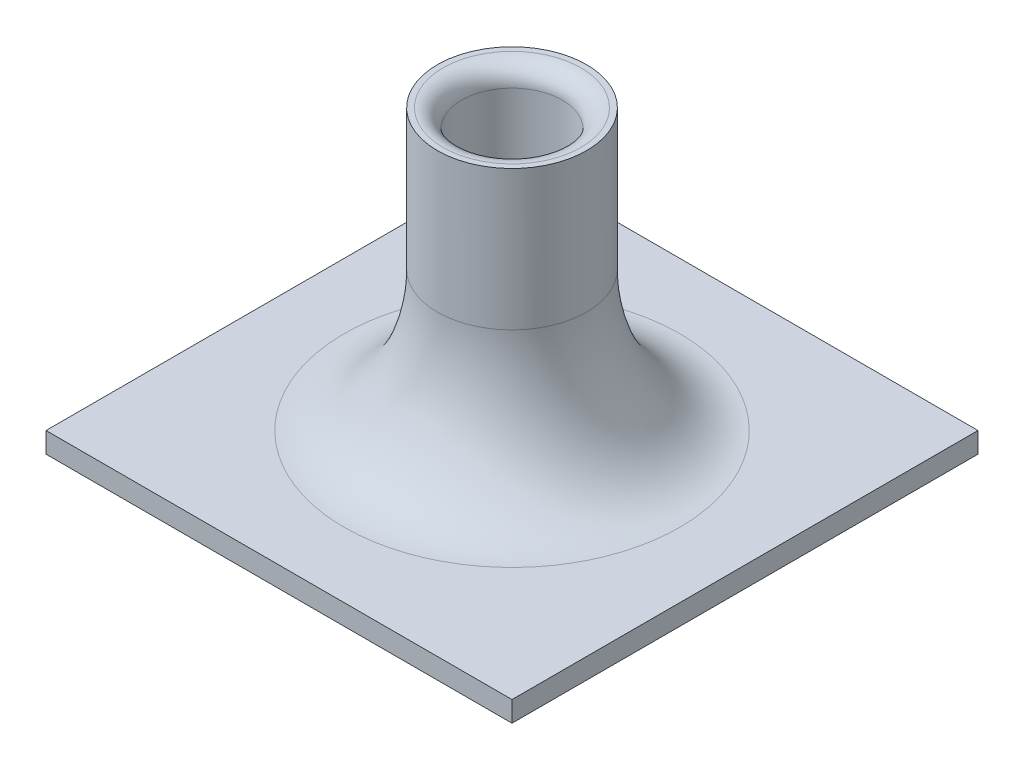
ISO-10303-21;
HEADER;
FILE_DESCRIPTION(('STEP AP214'),'2;1');
FILE_NAME('part.step','',(''),(''),'','','');
FILE_SCHEMA(('AUTOMOTIVE_DESIGN { 1 0 10303 214 1 1 1 1 }'));
ENDSEC;
DATA;
#1=APPLICATION_CONTEXT('core data for automotive mechanical design processes');
#2=APPLICATION_PROTOCOL_DEFINITION('international standard','automotive_design',2000,#1);
#3=PRODUCT_CONTEXT('',#1,'mechanical');
#4=PRODUCT('Part','Part','',(#3));
#5=PRODUCT_RELATED_PRODUCT_CATEGORY('part','',(#4));
#6=PRODUCT_DEFINITION_FORMATION('','',#4);
#7=PRODUCT_DEFINITION_CONTEXT('part definition',#1,'design');
#8=PRODUCT_DEFINITION('design','',#6,#7);
#9=PRODUCT_DEFINITION_SHAPE('','',#8);
#10=(LENGTH_UNIT() NAMED_UNIT(*) SI_UNIT(.MILLI.,.METRE.));
#11=(NAMED_UNIT(*) PLANE_ANGLE_UNIT() SI_UNIT($,.RADIAN.));
#12=(NAMED_UNIT(*) SI_UNIT($,.STERADIAN.) SOLID_ANGLE_UNIT());
#13=UNCERTAINTY_MEASURE_WITH_UNIT(LENGTH_MEASURE(1.E-05),#10,'distance_accuracy_value','');
#14=(GEOMETRIC_REPRESENTATION_CONTEXT(3) GLOBAL_UNCERTAINTY_ASSIGNED_CONTEXT((#13)) GLOBAL_UNIT_ASSIGNED_CONTEXT((#10,
#11,#12)) REPRESENTATION_CONTEXT('',''));
#15=CARTESIAN_POINT('',(0.,0.,0.));
#16=DIRECTION('',(0.,0.,1.));
#17=DIRECTION('',(1.,0.,0.));
#18=AXIS2_PLACEMENT_3D('',#15,#16,#17);
#19=CARTESIAN_POINT('',(25.,5.,25.));
#20=DIRECTION('',(-1.,0.,0.));
#21=DIRECTION('',(0.,0.,1.));
#22=AXIS2_PLACEMENT_3D('',#19,#20,#21);
#23=PLANE('',#22);
#24=DIRECTION('',(0.,-1.,0.));
#25=VECTOR('',#24,1.);
#26=CARTESIAN_POINT('',(25.,5.,25.));
#27=LINE('',#26,#25);
#28=CARTESIAN_POINT('',(25.,5.,25.));
#29=VERTEX_POINT('',#28);
#30=CARTESIAN_POINT('',(25.,2.79784594893,25.));
#31=VERTEX_POINT('',#30);
#32=EDGE_CURVE('E294',#29,#31,#27,.T.);
#33=ORIENTED_EDGE('',*,*,#32,.T.);
#34=DIRECTION('',(0.,0.,-1.));
#35=VECTOR('',#34,1.);
#36=CARTESIAN_POINT('',(25.,2.79784594893,-25.));
#37=LINE('',#36,#35);
#38=CARTESIAN_POINT('',(25.,2.79784594893,-25.));
#39=VERTEX_POINT('',#38);
#40=EDGE_CURVE('E56',#31,#39,#37,.T.);
#41=ORIENTED_EDGE('',*,*,#40,.T.);
#42=DIRECTION('',(0.,-1.,0.));
#43=VECTOR('',#42,1.);
#44=CARTESIAN_POINT('',(25.,5.,-25.));
#45=LINE('',#44,#43);
#46=CARTESIAN_POINT('',(25.,5.,-25.));
#47=VERTEX_POINT('',#46);
#48=EDGE_CURVE('E110',#47,#39,#45,.T.);
#49=ORIENTED_EDGE('',*,*,#48,.F.);
#50=DIRECTION('',(0.,0.,-1.));
#51=VECTOR('',#50,1.);
#52=CARTESIAN_POINT('',(25.,5.,25.));
#53=LINE('',#52,#51);
#54=EDGE_CURVE('E117',#29,#47,#53,.T.);
#55=ORIENTED_EDGE('',*,*,#54,.F.);
#56=EDGE_LOOP('',(#33,#41,#49,#55));
#57=FACE_BOUND('',#56,.T.);
#58=ADVANCED_FACE('F45',(#57),#23,.F.);
#59=CARTESIAN_POINT('',(-25.,5.,-25.));
#60=DIRECTION('',(0.,0.,1.));
#61=DIRECTION('',(1.,0.,0.));
#62=AXIS2_PLACEMENT_3D('',#59,#60,#61);
#63=PLANE('',#62);
#64=ORIENTED_EDGE('',*,*,#48,.T.);
#65=DIRECTION('',(-1.,0.,0.));
#66=VECTOR('',#65,1.);
#67=CARTESIAN_POINT('',(-25.,2.79784594893,-25.));
#68=LINE('',#67,#66);
#69=CARTESIAN_POINT('',(-25.,2.79784594893,-25.));
#70=VERTEX_POINT('',#69);
#71=EDGE_CURVE('E236',#39,#70,#68,.T.);
#72=ORIENTED_EDGE('',*,*,#71,.T.);
#73=DIRECTION('',(0.,-1.,0.));
#74=VECTOR('',#73,1.);
#75=CARTESIAN_POINT('',(-25.,5.,-25.));
#76=LINE('',#75,#74);
#77=CARTESIAN_POINT('',(-25.,5.,-25.));
#78=VERTEX_POINT('',#77);
#79=EDGE_CURVE('E112',#78,#70,#76,.T.);
#80=ORIENTED_EDGE('',*,*,#79,.F.);
#81=DIRECTION('',(-1.,0.,0.));
#82=VECTOR('',#81,1.);
#83=CARTESIAN_POINT('',(-25.,5.,-25.));
#84=LINE('',#83,#82);
#85=EDGE_CURVE('E105',#47,#78,#84,.T.);
#86=ORIENTED_EDGE('',*,*,#85,.F.);
#87=EDGE_LOOP('',(#64,#72,#80,#86));
#88=FACE_BOUND('',#87,.T.);
#89=ADVANCED_FACE('F107',(#88),#63,.F.);
#90=CARTESIAN_POINT('',(-25.,5.,25.));
#91=DIRECTION('',(1.,0.,0.));
#92=DIRECTION('',(0.,0.,-1.));
#93=AXIS2_PLACEMENT_3D('',#90,#91,#92);
#94=PLANE('',#93);
#95=ORIENTED_EDGE('',*,*,#79,.T.);
#96=DIRECTION('',(0.,0.,1.));
#97=VECTOR('',#96,1.);
#98=CARTESIAN_POINT('',(-25.,2.79784594893,25.));
#99=LINE('',#98,#97);
#100=CARTESIAN_POINT('',(-25.,2.79784594893,25.));
#101=VERTEX_POINT('',#100);
#102=EDGE_CURVE('E72',#70,#101,#99,.T.);
#103=ORIENTED_EDGE('',*,*,#102,.T.);
#104=DIRECTION('',(0.,-1.,0.));
#105=VECTOR('',#104,1.);
#106=CARTESIAN_POINT('',(-25.,5.,25.));
#107=LINE('',#106,#105);
#108=CARTESIAN_POINT('',(-25.,5.,25.));
#109=VERTEX_POINT('',#108);
#110=EDGE_CURVE('E136',#109,#101,#107,.T.);
#111=ORIENTED_EDGE('',*,*,#110,.F.);
#112=DIRECTION('',(0.,0.,1.));
#113=VECTOR('',#112,1.);
#114=CARTESIAN_POINT('',(-25.,5.,25.));
#115=LINE('',#114,#113);
#116=EDGE_CURVE('E116',#78,#109,#115,.T.);
#117=ORIENTED_EDGE('',*,*,#116,.F.);
#118=EDGE_LOOP('',(#95,#103,#111,#117));
#119=FACE_BOUND('',#118,.T.);
#120=ADVANCED_FACE('F304',(#119),#94,.F.);
#121=CARTESIAN_POINT('',(-25.,5.,25.));
#122=DIRECTION('',(0.,0.,-1.));
#123=DIRECTION('',(-1.,0.,0.));
#124=AXIS2_PLACEMENT_3D('',#121,#122,#123);
#125=PLANE('',#124);
#126=ORIENTED_EDGE('',*,*,#110,.T.);
#127=DIRECTION('',(1.,0.,0.));
#128=VECTOR('',#127,1.);
#129=CARTESIAN_POINT('',(25.,2.79784594893,25.));
#130=LINE('',#129,#128);
#131=EDGE_CURVE('E64',#101,#31,#130,.T.);
#132=ORIENTED_EDGE('',*,*,#131,.T.);
#133=ORIENTED_EDGE('',*,*,#32,.F.);
#134=DIRECTION('',(1.,0.,0.));
#135=VECTOR('',#134,1.);
#136=CARTESIAN_POINT('',(-25.,5.,25.));
#137=LINE('',#136,#135);
#138=EDGE_CURVE('E122',#109,#29,#137,.T.);
#139=ORIENTED_EDGE('',*,*,#138,.F.);
#140=EDGE_LOOP('',(#126,#132,#133,#139));
#141=FACE_BOUND('',#140,.T.);
#142=ADVANCED_FACE('F170',(#141),#125,.F.);
#143=CARTESIAN_POINT('',(0.,5.,0.));
#144=DIRECTION('',(0.,-1.,0.));
#145=DIRECTION('',(0.,0.,-1.));
#146=AXIS2_PLACEMENT_3D('',#143,#144,#145);
#147=PLANE('',#146);
#148=CARTESIAN_POINT('',(0.,5.,18.));
#149=CARTESIAN_POINT('',(2.35619448898032,5.,18.));
#150=CARTESIAN_POINT('',(4.71146191958669,5.,17.5315081795681));
#151=CARTESIAN_POINT('',(9.0651416455566,5.,15.7281549908382));
#152=CARTESIAN_POINT('',(11.061840960405,5.,14.3940031623107));
#153=CARTESIAN_POINT('',(14.3940031623107,5.,11.061840960405));
#154=CARTESIAN_POINT('',(15.7281549908423,5.,9.06514164555556));
#155=CARTESIAN_POINT('',(17.5315081795641,5.,4.71146191958769));
#156=CARTESIAN_POINT('',(18.,5.,2.35619448898031));
#157=CARTESIAN_POINT('',(18.,5.,-2.35619448898031));
#158=CARTESIAN_POINT('',(17.5315081795641,5.,-4.71146191958666));
#159=CARTESIAN_POINT('',(15.7281549908423,5.,-9.06514164555656));
#160=CARTESIAN_POINT('',(14.3940031623094,5.,-11.0618409604043));
#161=CARTESIAN_POINT('',(11.0618409604063,5.,-14.3940031623115));
#162=CARTESIAN_POINT('',(9.06514164555644,5.,-15.7281549908391));
#163=CARTESIAN_POINT('',(4.7114619195868,5.,-17.5315081795673));
#164=CARTESIAN_POINT('',(2.35619448899323,5.,-18.));
#165=CARTESIAN_POINT('',(-2.35619448899322,5.,-18.));
#166=CARTESIAN_POINT('',(-4.71146191958883,5.,-17.5315081795632));
#167=CARTESIAN_POINT('',(-9.06514164555439,5.,-15.7281549908432));
#168=CARTESIAN_POINT('',(-11.0618409604083,5.,-14.3940031623053));
#169=CARTESIAN_POINT('',(-14.3940031623074,5.,-11.0618409604104));
#170=CARTESIAN_POINT('',(-15.7281549908463,5.,-9.06514164553818));
#171=CARTESIAN_POINT('',(-17.53150817956,5.,-4.71146191960506));
#172=CARTESIAN_POINT('',(-18.,5.,-2.35619448898032));
#173=CARTESIAN_POINT('',(-18.,5.,2.3561944889803));
#174=CARTESIAN_POINT('',(-17.5315081795681,5.,4.71146191958669));
#175=CARTESIAN_POINT('',(-15.7281549908382,5.,9.0651416455566));
#176=CARTESIAN_POINT('',(-14.3940031623127,5.,11.0618409604071));
#177=CARTESIAN_POINT('',(-11.061840960403,5.,14.3940031623086));
#178=CARTESIAN_POINT('',(-9.06514164555654,5.,15.7281549908382));
#179=CARTESIAN_POINT('',(-4.71146191958663,5.,17.5315081795682));
#180=CARTESIAN_POINT('',(-2.3561944889803,5.,18.));
#181=CARTESIAN_POINT('',(0.,5.,18.));
#182=(BOUNDED_CURVE() B_SPLINE_CURVE(3,(#148,#149,#150,#151,#152,#153,#154,#155,#156,#157,#158,
#159,#160,#161,#162,#163,#164,#165,#166,#167,#168,#169,#170,#171,#172,#173,#174,#175,#176,#177,
#178,#179,#180,#181),.UNSPECIFIED.,.T.,.F.) B_SPLINE_CURVE_WITH_KNOTS((4,2,2,2,2,2,2,2,2,2,2,2,
2,2,2,2,4),(-3.14159265358979,-2.74889357189107,-2.35619449019234,-1.96349540849362,
-1.5707963267949,-1.17809724509617,-0.785398163397448,-0.392699081698724,0.,0.392699081698724,
0.785398163397448,1.17809724509617,1.5707963267949,1.96349540849362,2.35619449019234,
2.74889357189107,3.14159265358979),
.UNSPECIFIED.) CURVE() GEOMETRIC_REPRESENTATION_ITEM() RATIONAL_B_SPLINE_CURVE((1.,1.,1.,1.,1.,
1.,1.,1.,1.,1.,1.,1.,1.,1.,1.,1.,1.,1.,1.,1.,1.,1.,1.,1.,1.,1.,1.,1.,1.,1.,1.,1.,1.,1.)) REPRESENTATION_ITEM(''));
#183=CARTESIAN_POINT('',(0.,5.,18.));
#184=VERTEX_POINT('',#183);
#185=EDGE_CURVE('E245',#184,#184,#182,.F.);
#186=ORIENTED_EDGE('',*,*,#185,.T.);
#187=EDGE_LOOP('',(#186));
#188=FACE_BOUND('',#187,.T.);
#189=ORIENTED_EDGE('',*,*,#54,.T.);
#190=ORIENTED_EDGE('',*,*,#85,.T.);
#191=ORIENTED_EDGE('',*,*,#116,.T.);
#192=ORIENTED_EDGE('',*,*,#138,.T.);
#193=EDGE_LOOP('',(#189,#190,#191,#192));
#194=FACE_BOUND('',#193,.T.);
#195=ADVANCED_FACE('F120',(#188,#194),#147,.F.);
#196=CARTESIAN_POINT('',(0.,0.,0.));
#197=DIRECTION('',(0.,-1.,0.));
#198=DIRECTION('',(0.,0.,-1.));
#199=AXIS2_PLACEMENT_3D('',#196,#197,#198);
#200=PLANE('',#199);
#201=DIRECTION('',(0.,0.,-1.));
#202=VECTOR('',#201,1.);
#203=CARTESIAN_POINT('',(-18.9999999999999,0.,-25.));
#204=LINE('',#203,#202);
#205=CARTESIAN_POINT('',(-18.9999999999999,0.,18.9999999999999));
#206=VERTEX_POINT('',#205);
#207=CARTESIAN_POINT('',(-18.9999999999999,0.,-18.9999999999999));
#208=VERTEX_POINT('',#207);
#209=EDGE_CURVE('E255',#206,#208,#204,.T.);
#210=ORIENTED_EDGE('',*,*,#209,.T.);
#211=DIRECTION('',(1.,0.,0.));
#212=VECTOR('',#211,1.);
#213=CARTESIAN_POINT('',(25.,0.,-18.9999999999999));
#214=LINE('',#213,#212);
#215=CARTESIAN_POINT('',(18.9999999999999,0.,-18.9999999999999));
#216=VERTEX_POINT('',#215);
#217=EDGE_CURVE('E258',#208,#216,#214,.T.);
#218=ORIENTED_EDGE('',*,*,#217,.T.);
#219=DIRECTION('',(0.,0.,1.));
#220=VECTOR('',#219,1.);
#221=CARTESIAN_POINT('',(18.9999999999999,0.,25.));
#222=LINE('',#221,#220);
#223=CARTESIAN_POINT('',(18.9999999999999,0.,18.9999999999999));
#224=VERTEX_POINT('',#223);
#225=EDGE_CURVE('E249',#216,#224,#222,.T.);
#226=ORIENTED_EDGE('',*,*,#225,.T.);
#227=DIRECTION('',(-1.,0.,0.));
#228=VECTOR('',#227,1.);
#229=CARTESIAN_POINT('',(-25.,0.,18.9999999999999));
#230=LINE('',#229,#228);
#231=EDGE_CURVE('E252',#224,#206,#230,.T.);
#232=ORIENTED_EDGE('',*,*,#231,.T.);
#233=EDGE_LOOP('',(#210,#218,#226,#232));
#234=FACE_BOUND('',#233,.T.);
#235=CARTESIAN_POINT('',(0.,0.,0.));
#236=DIRECTION('',(0.,-1.,0.));
#237=DIRECTION('',(0.,0.,-1.));
#238=AXIS2_PLACEMENT_3D('',#235,#236,#237);
#239=CIRCLE('',#238,8.19784594893001);
#240=CARTESIAN_POINT('',(0.,0.,-8.19784594893001));
#241=VERTEX_POINT('',#240);
#242=EDGE_CURVE('E244',#241,#241,#239,.F.);
#243=ORIENTED_EDGE('',*,*,#242,.T.);
#244=EDGE_LOOP('',(#243));
#245=FACE_BOUND('',#244,.T.);
#246=ADVANCED_FACE('F165',(#234,#245),#200,.T.);
#247=CARTESIAN_POINT('',(0.,35.,0.));
#248=DIRECTION('',(0.,-1.,0.));
#249=DIRECTION('',(0.,0.,-1.));
#250=AXIS2_PLACEMENT_3D('',#247,#248,#249);
#251=CYLINDRICAL_SURFACE('',#250,8.);
#252=CARTESIAN_POINT('',(0.,20.,8.));
#253=CARTESIAN_POINT('',(-1.04719755065791,20.,8.));
#254=CARTESIAN_POINT('',(-2.09398307537179,20.,7.79178141314043));
#255=CARTESIAN_POINT('',(-4.02895184246962,20.,6.99029110704017));
#256=CARTESIAN_POINT('',(-4.91637376017921,20.,6.39733473880555));
#257=CARTESIAN_POINT('',(-6.39733473880555,20.,4.91637376017921));
#258=CARTESIAN_POINT('',(-6.99029110704015,20.,4.02895184246964));
#259=CARTESIAN_POINT('',(-7.79178141314042,20.,2.09398307537182));
#260=CARTESIAN_POINT('',(-7.99999999999999,20.,1.04719755065791));
#261=CARTESIAN_POINT('',(-7.99999999999999,20.,-1.04719755065792));
#262=CARTESIAN_POINT('',(-7.79178141313741,20.,-2.09398307537907));
#263=CARTESIAN_POINT('',(-6.99029110704316,20.,-4.02895184246237));
#264=CARTESIAN_POINT('',(-6.39733473880253,20.,-4.91637376018223));
#265=CARTESIAN_POINT('',(-4.91637376018222,20.,-6.39733473880254));
#266=CARTESIAN_POINT('',(-4.02895184246866,20.,-6.99029110704056));
#267=CARTESIAN_POINT('',(-2.09398307537276,20.,-7.79178141314003));
#268=CARTESIAN_POINT('',(-1.04719755066365,20.,-8.));
#269=CARTESIAN_POINT('',(1.04719755066366,20.,-8.));
#270=CARTESIAN_POINT('',(2.09398307537075,20.,-7.79178141314087));
#271=CARTESIAN_POINT('',(4.0289518424707,20.,-6.99029110703972));
#272=CARTESIAN_POINT('',(4.91637376017968,20.,-6.39733473880509));
#273=CARTESIAN_POINT('',(6.39733473880509,20.,-4.91637376017967));
#274=CARTESIAN_POINT('',(6.99029110704029,20.,-4.02895184246934));
#275=CARTESIAN_POINT('',(7.79178141314032,20.,-2.09398307537209));
#276=CARTESIAN_POINT('',(8.00000000000001,20.,-1.04719755065792));
#277=CARTESIAN_POINT('',(8.00000000000001,20.,1.04719755065792));
#278=CARTESIAN_POINT('',(7.79178141314007,20.,2.09398307537268));
#279=CARTESIAN_POINT('',(6.99029110704053,20.,4.02895184246876));
#280=CARTESIAN_POINT('',(6.39733473880504,20.,4.91637376017973));
#281=CARTESIAN_POINT('',(4.91637376017973,20.,6.39733473880504));
#282=CARTESIAN_POINT('',(4.02895184247037,20.,6.99029110703986));
#283=CARTESIAN_POINT('',(2.0939830753711,20.,7.79178141314073));
#284=CARTESIAN_POINT('',(1.04719755065792,20.,8.));
#285=CARTESIAN_POINT('',(0.,20.,8.));
#286=(BOUNDED_CURVE() B_SPLINE_CURVE(3,(#252,#253,#254,#255,#256,#257,#258,#259,#260,#261,#262,
#263,#264,#265,#266,#267,#268,#269,#270,#271,#272,#273,#274,#275,#276,#277,#278,#279,#280,#281,
#282,#283,#284,#285),.UNSPECIFIED.,.T.,.F.) B_SPLINE_CURVE_WITH_KNOTS((4,2,2,2,2,2,2,2,2,2,2,2,
2,2,2,2,4),(-3.14159265358979,-2.74889357189107,-2.35619449019234,-1.96349540849362,
-1.5707963267949,-1.17809724509617,-0.785398163397448,-0.392699081698724,0.,0.392699081698724,
0.785398163397448,1.17809724509617,1.5707963267949,1.96349540849362,2.35619449019234,
2.74889357189107,3.14159265358979),
.UNSPECIFIED.) CURVE() GEOMETRIC_REPRESENTATION_ITEM() RATIONAL_B_SPLINE_CURVE((1.,1.,1.,1.,1.,
1.,1.,1.,1.,1.,1.,1.,1.,1.,1.,1.,1.,1.,1.,1.,1.,1.,1.,1.,1.,1.,1.,1.,1.,1.,1.,1.,1.,1.)) REPRESENTATION_ITEM(''));
#287=CARTESIAN_POINT('',(0.,20.,8.));
#288=VERTEX_POINT('',#287);
#289=EDGE_CURVE('E143',#288,#288,#286,.F.);
#290=ORIENTED_EDGE('',*,*,#289,.T.);
#291=EDGE_LOOP('',(#290));
#292=FACE_BOUND('',#291,.T.);
#293=CARTESIAN_POINT('',(0.,35.,0.));
#294=DIRECTION('',(0.,1.,0.));
#295=DIRECTION('',(0.,0.,1.));
#296=AXIS2_PLACEMENT_3D('',#293,#294,#295);
#297=CIRCLE('',#296,8.);
#298=CARTESIAN_POINT('',(0.,35.,8.));
#299=VERTEX_POINT('',#298);
#300=EDGE_CURVE('E125',#299,#299,#297,.T.);
#301=ORIENTED_EDGE('',*,*,#300,.F.);
#302=EDGE_LOOP('',(#301));
#303=FACE_BOUND('',#302,.T.);
#304=ADVANCED_FACE('F154',(#292,#303),#251,.T.);
#305=CARTESIAN_POINT('',(0.,35.,0.));
#306=DIRECTION('',(0.,1.,0.));
#307=DIRECTION('',(0.,0.,1.));
#308=AXIS2_PLACEMENT_3D('',#305,#306,#307);
#309=PLANE('',#308);
#310=CARTESIAN_POINT('',(0.,35.,0.));
#311=DIRECTION('',(0.,1.,0.));
#312=DIRECTION('',(0.,0.,1.));
#313=AXIS2_PLACEMENT_3D('',#310,#311,#312);
#314=CIRCLE('',#313,7.4);
#315=CARTESIAN_POINT('',(0.,35.,7.4));
#316=VERTEX_POINT('',#315);
#317=EDGE_CURVE('E134',#316,#316,#314,.F.);
#318=ORIENTED_EDGE('',*,*,#317,.T.);
#319=EDGE_LOOP('',(#318));
#320=FACE_BOUND('',#319,.T.);
#321=ORIENTED_EDGE('',*,*,#300,.T.);
#322=EDGE_LOOP('',(#321));
#323=FACE_BOUND('',#322,.T.);
#324=ADVANCED_FACE('F164',(#320,#323),#309,.T.);
#325=CARTESIAN_POINT('',(0.,0.,0.));
#326=DIRECTION('',(0.,1.,0.));
#327=DIRECTION('',(0.,0.,1.));
#328=AXIS2_PLACEMENT_3D('',#325,#326,#327);
#329=CYLINDRICAL_SURFACE('',#328,5.4);
#330=CARTESIAN_POINT('',(0.,6.00000000000009,0.));
#331=DIRECTION('',(0.,-1.,0.));
#332=DIRECTION('',(0.,0.,-1.));
#333=AXIS2_PLACEMENT_3D('',#330,#331,#332);
#334=CIRCLE('',#333,5.4);
#335=CARTESIAN_POINT('',(0.,6.00000000000009,-5.4));
#336=VERTEX_POINT('',#335);
#337=EDGE_CURVE('E12',#336,#336,#334,.T.);
#338=ORIENTED_EDGE('',*,*,#337,.T.);
#339=EDGE_LOOP('',(#338));
#340=FACE_BOUND('',#339,.T.);
#341=CARTESIAN_POINT('',(0.,33.,0.));
#342=DIRECTION('',(0.,1.,0.));
#343=DIRECTION('',(0.,0.,1.));
#344=AXIS2_PLACEMENT_3D('',#341,#342,#343);
#345=CIRCLE('',#344,5.4);
#346=CARTESIAN_POINT('',(0.,33.,5.4));
#347=VERTEX_POINT('',#346);
#348=EDGE_CURVE('E129',#347,#347,#345,.T.);
#349=ORIENTED_EDGE('',*,*,#348,.T.);
#350=EDGE_LOOP('',(#349));
#351=FACE_BOUND('',#350,.T.);
#352=ADVANCED_FACE('F345',(#340,#351),#329,.F.);
#353=CARTESIAN_POINT('',(0.,33.,0.));
#354=DIRECTION('',(0.,1.,0.));
#355=DIRECTION('',(0.,0.,1.));
#356=AXIS2_PLACEMENT_3D('',#353,#354,#355);
#357=TOROIDAL_SURFACE('',#356,7.4,2.);
#358=ORIENTED_EDGE('',*,*,#317,.F.);
#359=EDGE_LOOP('',(#358));
#360=FACE_BOUND('',#359,.T.);
#361=ORIENTED_EDGE('',*,*,#348,.F.);
#362=EDGE_LOOP('',(#361));
#363=FACE_BOUND('',#362,.T.);
#364=ADVANCED_FACE('F205',(#360,#363),#357,.T.);
#365=CARTESIAN_POINT('',(0.,5.,18.));
#366=CARTESIAN_POINT('',(-2.3561944889803,5.,18.));
#367=CARTESIAN_POINT('',(-4.71146191958663,5.,17.5315081795682));
#368=CARTESIAN_POINT('',(-9.06514164555654,5.,15.7281549908382));
#369=CARTESIAN_POINT('',(-11.061840960403,5.,14.3940031623086));
#370=CARTESIAN_POINT('',(-14.3940031623127,5.,11.0618409604071));
#371=CARTESIAN_POINT('',(-15.7281549908382,5.,9.0651416455566));
#372=CARTESIAN_POINT('',(-17.5315081795681,5.,4.71146191958669));
#373=CARTESIAN_POINT('',(-18.,5.,2.3561944889803));
#374=CARTESIAN_POINT('',(-18.,5.,-2.35619448898032));
#375=CARTESIAN_POINT('',(-17.53150817956,5.,-4.71146191960506));
#376=CARTESIAN_POINT('',(-15.7281549908463,5.,-9.06514164553818));
#377=CARTESIAN_POINT('',(-14.3940031623074,5.,-11.0618409604104));
#378=CARTESIAN_POINT('',(-11.0618409604083,5.,-14.3940031623053));
#379=CARTESIAN_POINT('',(-9.06514164555439,5.,-15.7281549908432));
#380=CARTESIAN_POINT('',(-4.71146191958883,5.,-17.5315081795632));
#381=CARTESIAN_POINT('',(-2.35619448899322,5.,-18.));
#382=CARTESIAN_POINT('',(2.35619448899323,5.,-18.));
#383=CARTESIAN_POINT('',(4.7114619195868,5.,-17.5315081795673));
#384=CARTESIAN_POINT('',(9.06514164555644,5.,-15.7281549908391));
#385=CARTESIAN_POINT('',(11.0618409604063,5.,-14.3940031623115));
#386=CARTESIAN_POINT('',(14.3940031623094,5.,-11.0618409604043));
#387=CARTESIAN_POINT('',(15.7281549908423,5.,-9.06514164555656));
#388=CARTESIAN_POINT('',(17.5315081795641,5.,-4.71146191958666));
#389=CARTESIAN_POINT('',(18.,5.,-2.35619448898031));
#390=CARTESIAN_POINT('',(18.,5.,2.35619448898031));
#391=CARTESIAN_POINT('',(17.5315081795641,5.,4.71146191958769));
#392=CARTESIAN_POINT('',(15.7281549908423,5.,9.06514164555556));
#393=CARTESIAN_POINT('',(14.3940031623107,5.,11.061840960405));
#394=CARTESIAN_POINT('',(11.061840960405,5.,14.3940031623107));
#395=CARTESIAN_POINT('',(9.0651416455566,5.,15.7281549908382));
#396=CARTESIAN_POINT('',(4.71146191958669,5.,17.5315081795681));
#397=CARTESIAN_POINT('',(2.35619448898032,5.,18.));
#398=CARTESIAN_POINT('',(0.,5.,18.));
#399=CARTESIAN_POINT('',(0.,5.,8.));
#400=CARTESIAN_POINT('',(-1.04719755065791,5.,8.));
#401=CARTESIAN_POINT('',(-2.09398307537172,5.00000000000204,7.79178141313823));
#402=CARTESIAN_POINT('',(-4.02895184246968,4.99999999999796,6.99029110704237));
#403=CARTESIAN_POINT('',(-4.91637376017615,5.00000000000204,6.39733473880657));
#404=CARTESIAN_POINT('',(-6.39733473880861,4.99999999999796,4.91637376017819));
#405=CARTESIAN_POINT('',(-6.99029110703827,5.,4.02895184247022));
#406=CARTESIAN_POINT('',(-7.7917814131423,5.,2.09398307537124));
#407=CARTESIAN_POINT('',(-7.99999999999999,5.,1.04719755065791));
#408=CARTESIAN_POINT('',(-7.99999999999999,5.,-1.04719755065792));
#409=CARTESIAN_POINT('',(-7.79178141313821,4.99999999999796,-2.0939830753794));
#410=CARTESIAN_POINT('',(-6.99029110704236,5.00000000000204,-4.02895184246204));
#411=CARTESIAN_POINT('',(-6.39733473880406,5.,-4.91637376018376));
#412=CARTESIAN_POINT('',(-4.91637376018069,5.,-6.39733473880101));
#413=CARTESIAN_POINT('',(-4.02895184246719,4.99999999999591,-6.99029110704073));
#414=CARTESIAN_POINT('',(-2.09398307537423,5.00000000000409,-7.79178141313986));
#415=CARTESIAN_POINT('',(-1.04719755066365,5.,-8.));
#416=CARTESIAN_POINT('',(1.04719755066366,5.,-8.));
#417=CARTESIAN_POINT('',(2.09398307537067,5.,-7.79178141313986));
#418=CARTESIAN_POINT('',(4.02895184247078,5.,-6.99029110704073));
#419=CARTESIAN_POINT('',(4.91637376017866,5.,-6.39733473880509));
#420=CARTESIAN_POINT('',(6.39733473880612,5.,-4.91637376017967));
#421=CARTESIAN_POINT('',(6.99029110704238,5.00000000000204,-4.02895184247123));
#422=CARTESIAN_POINT('',(7.79178141313823,4.99999999999796,-2.0939830753702));
#423=CARTESIAN_POINT('',(8.00000000000001,5.,-1.04719755065792));
#424=CARTESIAN_POINT('',(8.00000000000001,5.,1.04719755065792));
#425=CARTESIAN_POINT('',(7.79178141314027,4.99999999999796,2.09398307537225));
#426=CARTESIAN_POINT('',(6.99029110704033,5.00000000000204,4.02895184246919));
#427=CARTESIAN_POINT('',(6.39733473880555,4.99999999999591,4.91637376018024));
#428=CARTESIAN_POINT('',(4.91637376017922,5.00000000000409,6.39733473880453));
#429=CARTESIAN_POINT('',(4.02895184246869,4.99999999999796,6.99029110703624));
#430=CARTESIAN_POINT('',(2.09398307537278,5.00000000000204,7.79178141314435));
#431=CARTESIAN_POINT('',(1.04719755065792,5.,8.));
#432=CARTESIAN_POINT('',(0.,5.,8.));
#433=CARTESIAN_POINT('',(0.,20.,8.));
#434=CARTESIAN_POINT('',(-1.04719755065791,20.,8.));
#435=CARTESIAN_POINT('',(-2.09398307537179,20.,7.79178141314043));
#436=CARTESIAN_POINT('',(-4.02895184246962,20.,6.99029110704017));
#437=CARTESIAN_POINT('',(-4.91637376017921,20.,6.39733473880555));
#438=CARTESIAN_POINT('',(-6.39733473880555,20.,4.91637376017921));
#439=CARTESIAN_POINT('',(-6.99029110704015,20.,4.02895184246964));
#440=CARTESIAN_POINT('',(-7.79178141314042,20.,2.09398307537182));
#441=CARTESIAN_POINT('',(-7.99999999999999,20.,1.04719755065791));
#442=CARTESIAN_POINT('',(-7.99999999999999,20.,-1.04719755065792));
#443=CARTESIAN_POINT('',(-7.79178141313741,20.,-2.09398307537907));
#444=CARTESIAN_POINT('',(-6.99029110704316,20.,-4.02895184246237));
#445=CARTESIAN_POINT('',(-6.39733473880253,20.,-4.91637376018223));
#446=CARTESIAN_POINT('',(-4.91637376018222,20.,-6.39733473880254));
#447=CARTESIAN_POINT('',(-4.02895184246866,20.,-6.99029110704056));
#448=CARTESIAN_POINT('',(-2.09398307537276,20.,-7.79178141314003));
#449=CARTESIAN_POINT('',(-1.04719755066365,20.,-8.));
#450=CARTESIAN_POINT('',(1.04719755066366,20.,-8.));
#451=CARTESIAN_POINT('',(2.09398307537075,20.,-7.79178141314087));
#452=CARTESIAN_POINT('',(4.0289518424707,20.,-6.99029110703972));
#453=CARTESIAN_POINT('',(4.91637376017968,20.,-6.39733473880509));
#454=CARTESIAN_POINT('',(6.39733473880509,20.,-4.91637376017967));
#455=CARTESIAN_POINT('',(6.99029110704029,20.,-4.02895184246934));
#456=CARTESIAN_POINT('',(7.79178141314032,20.,-2.09398307537209));
#457=CARTESIAN_POINT('',(8.00000000000001,20.,-1.04719755065792));
#458=CARTESIAN_POINT('',(8.00000000000001,20.,1.04719755065792));
#459=CARTESIAN_POINT('',(7.79178141314007,20.,2.09398307537268));
#460=CARTESIAN_POINT('',(6.99029110704053,20.,4.02895184246876));
#461=CARTESIAN_POINT('',(6.39733473880504,20.,4.91637376017973));
#462=CARTESIAN_POINT('',(4.91637376017973,20.,6.39733473880504));
#463=CARTESIAN_POINT('',(4.02895184247037,20.,6.99029110703986));
#464=CARTESIAN_POINT('',(2.0939830753711,20.,7.79178141314073));
#465=CARTESIAN_POINT('',(1.04719755065792,20.,8.));
#466=CARTESIAN_POINT('',(0.,20.,8.));
#467=(BOUNDED_SURFACE() B_SPLINE_SURFACE(2,3,((#365,#366,#367,#368,#369,#370,#371,#372,#373,
#374,#375,#376,#377,#378,#379,#380,#381,#382,#383,#384,#385,#386,#387,#388,#389,#390,#391,#392,
#393,#394,#395,#396,#397,#398),(#399,#400,#401,#402,#403,#404,#405,#406,#407,#408,#409,#410,
#411,#412,#413,#414,#415,#416,#417,#418,#419,#420,#421,#422,#423,#424,#425,#426,#427,#428,#429,
#430,#431,#432),(#433,#434,#435,#436,#437,#438,#439,#440,#441,#442,#443,#444,#445,#446,#447,
#448,#449,#450,#451,#452,#453,#454,#455,#456,#457,#458,#459,#460,#461,#462,#463,#464,#465,
#466)),.UNSPECIFIED.,.F.,.T.,.F.) B_SPLINE_SURFACE_WITH_KNOTS((3,3),(4,2,2,2,2,2,2,2,2,2,2,2,2,
2,2,2,4),(0.,1.),(-3.14159265358979,-2.74889357189107,-2.35619449019234,-1.96349540849362,
-1.5707963267949,-1.17809724509617,-0.785398163397448,-0.392699081698724,0.,0.392699081698724,
0.785398163397448,1.17809724509617,1.5707963267949,1.96349540849362,2.35619449019234,
2.74889357189107,3.14159265358979),
.UNSPECIFIED.) GEOMETRIC_REPRESENTATION_ITEM() RATIONAL_B_SPLINE_SURFACE(((1.,1.,1.,1.,1.,1.,1.,
1.,1.,1.,1.,1.,1.,1.,1.,1.,1.,1.,1.,1.,1.,1.,1.,1.,1.,1.,1.,1.,1.,1.,1.,1.,1.,1.),
(0.707106781186548,0.707106781186548,0.707106781186548,0.707106781186548,0.707106781186547,
0.707106781186547,0.707106781186548,0.707106781186548,0.707106781186548,0.707106781186548,
0.707106781186548,0.707106781186548,0.707106781186548,0.707106781186548,0.707106781186548,
0.707106781186548,0.707106781186548,0.707106781186548,0.707106781186548,0.707106781186548,
0.707106781186547,0.707106781186547,0.707106781186548,0.707106781186548,0.707106781186548,
0.707106781186548,0.707106781186548,0.707106781186548,0.707106781186548,0.707106781186548,
0.707106781186548,0.707106781186548,0.707106781186548,0.707106781186548),(1.,1.,1.,1.,1.,1.,1.,
1.,1.,1.,1.,1.,1.,1.,1.,1.,1.,1.,1.,1.,1.,1.,1.,1.,1.,1.,1.,1.,1.,1.,1.,1.,1.,1.))) REPRESENTATION_ITEM('') SURFACE());
#468=ORIENTED_EDGE('',*,*,#185,.F.);
#469=EDGE_LOOP('',(#468));
#470=FACE_BOUND('',#469,.T.);
#471=ORIENTED_EDGE('',*,*,#289,.F.);
#472=EDGE_LOOP('',(#471));
#473=FACE_BOUND('',#472,.T.);
#474=ADVANCED_FACE('F189',(#470,#473),#467,.T.);
#475=CARTESIAN_POINT('',(-25.,2.79784594893,25.));
#476=DIRECTION('',(0.,-0.906307787036651,0.422618261740697));
#477=DIRECTION('',(-1.,0.,0.));
#478=AXIS2_PLACEMENT_3D('',#475,#476,#477);
#479=PLANE('',#478);
#480=DIRECTION('',(0.671542934237819,-0.313145613014971,-0.671542934237819));
#481=VECTOR('',#480,1.);
#482=CARTESIAN_POINT('',(-25.,2.79784594893,25.));
#483=LINE('',#482,#481);
#484=EDGE_CURVE('E273',#206,#101,#483,.F.);
#485=ORIENTED_EDGE('',*,*,#484,.F.);
#486=ORIENTED_EDGE('',*,*,#231,.F.);
#487=DIRECTION('',(-0.671542934237819,-0.313145613014971,-0.671542934237819));
#488=VECTOR('',#487,1.);
#489=CARTESIAN_POINT('',(25.,2.79784594893,25.));
#490=LINE('',#489,#488);
#491=EDGE_CURVE('E50',#31,#224,#490,.T.);
#492=ORIENTED_EDGE('',*,*,#491,.F.);
#493=ORIENTED_EDGE('',*,*,#131,.F.);
#494=EDGE_LOOP('',(#485,#486,#492,#493));
#495=FACE_BOUND('',#494,.T.);
#496=ADVANCED_FACE('F204',(#495),#479,.T.);
#497=CARTESIAN_POINT('',(25.,2.79784594893,25.));
#498=DIRECTION('',(0.422618261740697,-0.906307787036651,0.));
#499=DIRECTION('',(0.,0.,1.));
#500=AXIS2_PLACEMENT_3D('',#497,#498,#499);
#501=PLANE('',#500);
#502=ORIENTED_EDGE('',*,*,#491,.T.);
#503=ORIENTED_EDGE('',*,*,#225,.F.);
#504=DIRECTION('',(0.671542934237819,0.313145613014971,-0.671542934237819));
#505=VECTOR('',#504,1.);
#506=CARTESIAN_POINT('',(2.45150437376304,-7.7166902414587,-2.45150437376306));
#507=LINE('',#506,#505);
#508=EDGE_CURVE('E271',#39,#216,#507,.F.);
#509=ORIENTED_EDGE('',*,*,#508,.F.);
#510=ORIENTED_EDGE('',*,*,#40,.F.);
#511=EDGE_LOOP('',(#502,#503,#509,#510));
#512=FACE_BOUND('',#511,.T.);
#513=ADVANCED_FACE('F299',(#512),#501,.T.);
#514=CARTESIAN_POINT('',(-25.,2.79784594893,25.));
#515=DIRECTION('',(-0.422618261740697,-0.906307787036651,0.));
#516=DIRECTION('',(0.,0.,-1.));
#517=AXIS2_PLACEMENT_3D('',#514,#515,#516);
#518=PLANE('',#517);
#519=ORIENTED_EDGE('',*,*,#484,.T.);
#520=ORIENTED_EDGE('',*,*,#102,.F.);
#521=DIRECTION('',(0.671542934237819,-0.313145613014971,0.671542934237819));
#522=VECTOR('',#521,1.);
#523=CARTESIAN_POINT('',(-2.45150437376304,-7.7166902414587,-2.45150437376306));
#524=LINE('',#523,#522);
#525=EDGE_CURVE('E268',#208,#70,#524,.F.);
#526=ORIENTED_EDGE('',*,*,#525,.F.);
#527=ORIENTED_EDGE('',*,*,#209,.F.);
#528=EDGE_LOOP('',(#519,#520,#526,#527));
#529=FACE_BOUND('',#528,.T.);
#530=ADVANCED_FACE('F370',(#529),#518,.T.);
#531=CARTESIAN_POINT('',(-25.,2.79784594893,-25.));
#532=DIRECTION('',(0.,-0.906307787036651,-0.422618261740697));
#533=DIRECTION('',(1.,0.,0.));
#534=AXIS2_PLACEMENT_3D('',#531,#532,#533);
#535=PLANE('',#534);
#536=ORIENTED_EDGE('',*,*,#508,.T.);
#537=ORIENTED_EDGE('',*,*,#217,.F.);
#538=ORIENTED_EDGE('',*,*,#525,.T.);
#539=ORIENTED_EDGE('',*,*,#71,.F.);
#540=EDGE_LOOP('',(#536,#537,#538,#539));
#541=FACE_BOUND('',#540,.T.);
#542=ADVANCED_FACE('F209',(#541),#535,.T.);
#543=CARTESIAN_POINT('',(0.,0.,0.));
#544=DIRECTION('',(0.,-1.,0.));
#545=DIRECTION('',(0.,0.,-1.));
#546=AXIS2_PLACEMENT_3D('',#543,#544,#545);
#547=CONICAL_SURFACE('',#546,8.19784594893001,0.43633231299858);
#548=ORIENTED_EDGE('',*,*,#337,.F.);
#549=EDGE_LOOP('',(#548));
#550=FACE_BOUND('',#549,.T.);
#551=ORIENTED_EDGE('',*,*,#242,.F.);
#552=EDGE_LOOP('',(#551));
#553=FACE_BOUND('',#552,.T.);
#554=ADVANCED_FACE('F48',(#550,#553),#547,.F.);
#555=CLOSED_SHELL('',(#58,#89,#120,#142,#195,#246,#304,#324,#352,#364,#474,#496,#513,#530,#542,#554));
#556=MANIFOLD_SOLID_BREP('B2',#555);
#557=ADVANCED_BREP_SHAPE_REPRESENTATION('',(#18,#556),#14);
#558=SHAPE_DEFINITION_REPRESENTATION(#9,#557);
ENDSEC;
END-ISO-10303-21;
